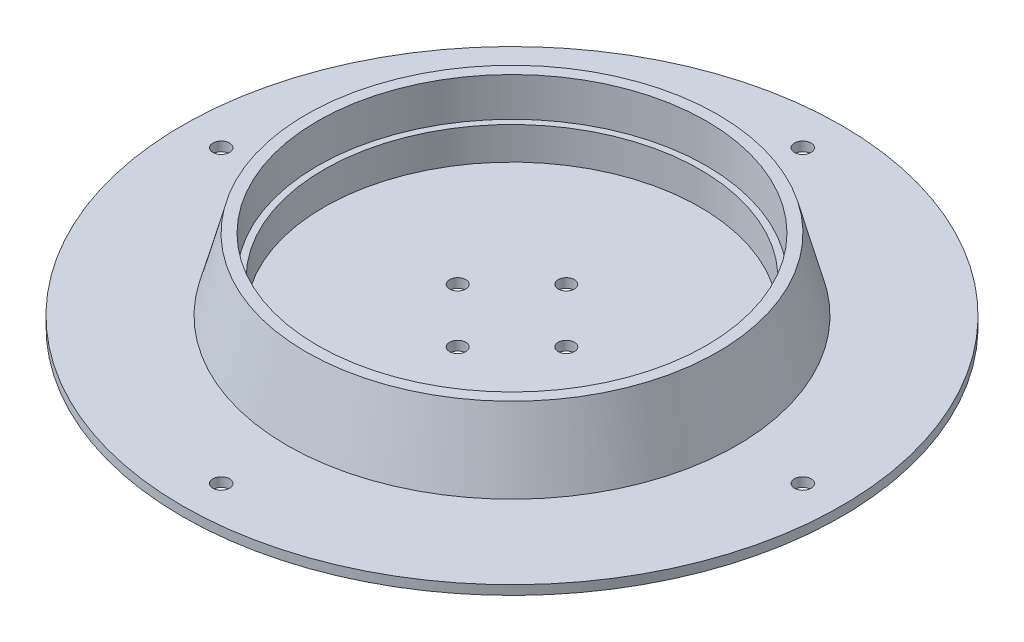
ISO-10303-21;
HEADER;
FILE_DESCRIPTION(('STEP AP214'),'2;1');
FILE_NAME('part.step','',(''),(''),'','','');
FILE_SCHEMA(('AUTOMOTIVE_DESIGN { 1 0 10303 214 1 1 1 1 }'));
ENDSEC;
DATA;
#1=APPLICATION_CONTEXT('core data for automotive mechanical design processes');
#2=APPLICATION_PROTOCOL_DEFINITION('international standard','automotive_design',2000,#1);
#3=PRODUCT_CONTEXT('',#1,'mechanical');
#4=PRODUCT('Part','Part','',(#3));
#5=PRODUCT_RELATED_PRODUCT_CATEGORY('part','',(#4));
#6=PRODUCT_DEFINITION_FORMATION('','',#4);
#7=PRODUCT_DEFINITION_CONTEXT('part definition',#1,'design');
#8=PRODUCT_DEFINITION('design','',#6,#7);
#9=PRODUCT_DEFINITION_SHAPE('','',#8);
#10=(LENGTH_UNIT() NAMED_UNIT(*) SI_UNIT(.MILLI.,.METRE.));
#11=(NAMED_UNIT(*) PLANE_ANGLE_UNIT() SI_UNIT($,.RADIAN.));
#12=(NAMED_UNIT(*) SI_UNIT($,.STERADIAN.) SOLID_ANGLE_UNIT());
#13=UNCERTAINTY_MEASURE_WITH_UNIT(LENGTH_MEASURE(1.E-05),#10,'distance_accuracy_value','');
#14=(GEOMETRIC_REPRESENTATION_CONTEXT(3) GLOBAL_UNCERTAINTY_ASSIGNED_CONTEXT((#13)) GLOBAL_UNIT_ASSIGNED_CONTEXT((#10,
#11,#12)) REPRESENTATION_CONTEXT('',''));
#15=CARTESIAN_POINT('',(0.,0.,0.));
#16=DIRECTION('',(0.,0.,1.));
#17=DIRECTION('',(1.,0.,0.));
#18=AXIS2_PLACEMENT_3D('',#15,#16,#17);
#19=CARTESIAN_POINT('',(0.,2.4,0.));
#20=DIRECTION('',(0.,1.,0.));
#21=DIRECTION('',(0.,0.,1.));
#22=AXIS2_PLACEMENT_3D('',#19,#20,#21);
#23=PLANE('',#22);
#24=CARTESIAN_POINT('',(0.,2.4,0.));
#25=DIRECTION('',(0.,1.,0.));
#26=DIRECTION('',(0.,0.,1.));
#27=AXIS2_PLACEMENT_3D('',#24,#25,#26);
#28=CIRCLE('',#27,58.);
#29=CARTESIAN_POINT('',(0.,2.4,58.));
#30=VERTEX_POINT('',#29);
#31=EDGE_CURVE('E10',#30,#30,#28,.T.);
#32=ORIENTED_EDGE('',*,*,#31,.F.);
#33=EDGE_LOOP('',(#32));
#34=FACE_BOUND('',#33,.T.);
#35=CARTESIAN_POINT('',(75.,2.4,5.2372220082647E-13));
#36=DIRECTION('',(0.,1.,0.));
#37=DIRECTION('',(0.,0.,1.));
#38=AXIS2_PLACEMENT_3D('',#35,#36,#37);
#39=CIRCLE('',#38,2.13245703125);
#40=CARTESIAN_POINT('',(75.,2.4,2.13245703125052));
#41=VERTEX_POINT('',#40);
#42=EDGE_CURVE('E92',#41,#41,#39,.T.);
#43=ORIENTED_EDGE('',*,*,#42,.F.);
#44=EDGE_LOOP('',(#43));
#45=FACE_BOUND('',#44,.T.);
#46=CARTESIAN_POINT('',(-75.,2.4,0.));
#47=DIRECTION('',(0.,1.,0.));
#48=DIRECTION('',(0.,0.,1.));
#49=AXIS2_PLACEMENT_3D('',#46,#47,#48);
#50=CIRCLE('',#49,2.13245703125);
#51=CARTESIAN_POINT('',(-75.,2.4,2.13245703125));
#52=VERTEX_POINT('',#51);
#53=EDGE_CURVE('E104',#52,#52,#50,.T.);
#54=ORIENTED_EDGE('',*,*,#53,.F.);
#55=EDGE_LOOP('',(#54));
#56=FACE_BOUND('',#55,.T.);
#57=CARTESIAN_POINT('',(0.,2.4,0.));
#58=DIRECTION('',(0.,1.,0.));
#59=DIRECTION('',(0.,0.,1.));
#60=AXIS2_PLACEMENT_3D('',#57,#58,#59);
#61=CIRCLE('',#60,85.);
#62=CARTESIAN_POINT('',(0.,2.4,85.));
#63=VERTEX_POINT('',#62);
#64=EDGE_CURVE('E47',#63,#63,#61,.T.);
#65=ORIENTED_EDGE('',*,*,#64,.T.);
#66=EDGE_LOOP('',(#65));
#67=FACE_BOUND('',#66,.T.);
#68=CARTESIAN_POINT('',(2.61861100413235E-13,2.4,-75.));
#69=DIRECTION('',(0.,1.,0.));
#70=DIRECTION('',(0.,0.,1.));
#71=AXIS2_PLACEMENT_3D('',#68,#69,#70);
#72=CIRCLE('',#71,2.13245703125);
#73=CARTESIAN_POINT('',(2.61861100413235E-13,2.4,-72.86754296875));
#74=VERTEX_POINT('',#73);
#75=EDGE_CURVE('E98',#74,#74,#72,.T.);
#76=ORIENTED_EDGE('',*,*,#75,.F.);
#77=EDGE_LOOP('',(#76));
#78=FACE_BOUND('',#77,.T.);
#79=CARTESIAN_POINT('',(-7.85583301239705E-13,2.4,75.));
#80=DIRECTION('',(0.,1.,0.));
#81=DIRECTION('',(0.,0.,1.));
#82=AXIS2_PLACEMENT_3D('',#79,#80,#81);
#83=CIRCLE('',#82,2.13245703125);
#84=CARTESIAN_POINT('',(-7.85583301239705E-13,2.4,77.13245703125));
#85=VERTEX_POINT('',#84);
#86=EDGE_CURVE('E86',#85,#85,#83,.T.);
#87=ORIENTED_EDGE('',*,*,#86,.F.);
#88=EDGE_LOOP('',(#87));
#89=FACE_BOUND('',#88,.T.);
#90=ADVANCED_FACE('F39',(#34,#45,#56,#67,#78,#89),#23,.T.);
#91=CARTESIAN_POINT('',(0.,0.,0.));
#92=DIRECTION('',(0.,1.,0.));
#93=DIRECTION('',(0.,0.,1.));
#94=AXIS2_PLACEMENT_3D('',#91,#92,#93);
#95=PLANE('',#94);
#96=CARTESIAN_POINT('',(0.,0.,0.));
#97=DIRECTION('',(0.,1.,0.));
#98=DIRECTION('',(0.,0.,1.));
#99=AXIS2_PLACEMENT_3D('',#96,#97,#98);
#100=CIRCLE('',#99,85.);
#101=CARTESIAN_POINT('',(0.,0.,85.));
#102=VERTEX_POINT('',#101);
#103=EDGE_CURVE('E43',#102,#102,#100,.T.);
#104=ORIENTED_EDGE('',*,*,#103,.F.);
#105=EDGE_LOOP('',(#104));
#106=FACE_BOUND('',#105,.T.);
#107=CARTESIAN_POINT('',(-75.,0.,0.));
#108=DIRECTION('',(0.,1.,0.));
#109=DIRECTION('',(0.,0.,1.));
#110=AXIS2_PLACEMENT_3D('',#107,#108,#109);
#111=CIRCLE('',#110,2.13245703125);
#112=CARTESIAN_POINT('',(-75.,0.,2.13245703125));
#113=VERTEX_POINT('',#112);
#114=EDGE_CURVE('E101',#113,#113,#111,.T.);
#115=ORIENTED_EDGE('',*,*,#114,.T.);
#116=EDGE_LOOP('',(#115));
#117=FACE_BOUND('',#116,.T.);
#118=CARTESIAN_POINT('',(2.61861100413235E-13,0.,-75.));
#119=DIRECTION('',(0.,1.,0.));
#120=DIRECTION('',(0.,0.,1.));
#121=AXIS2_PLACEMENT_3D('',#118,#119,#120);
#122=CIRCLE('',#121,2.13245703125);
#123=CARTESIAN_POINT('',(2.61861100413235E-13,0.,-72.86754296875));
#124=VERTEX_POINT('',#123);
#125=EDGE_CURVE('E95',#124,#124,#122,.T.);
#126=ORIENTED_EDGE('',*,*,#125,.T.);
#127=EDGE_LOOP('',(#126));
#128=FACE_BOUND('',#127,.T.);
#129=CARTESIAN_POINT('',(75.,0.,5.2372220082647E-13));
#130=DIRECTION('',(0.,1.,0.));
#131=DIRECTION('',(0.,0.,1.));
#132=AXIS2_PLACEMENT_3D('',#129,#130,#131);
#133=CIRCLE('',#132,2.13245703125);
#134=CARTESIAN_POINT('',(75.,0.,2.13245703125052));
#135=VERTEX_POINT('',#134);
#136=EDGE_CURVE('E89',#135,#135,#133,.T.);
#137=ORIENTED_EDGE('',*,*,#136,.T.);
#138=EDGE_LOOP('',(#137));
#139=FACE_BOUND('',#138,.T.);
#140=CARTESIAN_POINT('',(-7.85583301239705E-13,0.,75.));
#141=DIRECTION('',(0.,1.,0.));
#142=DIRECTION('',(0.,0.,1.));
#143=AXIS2_PLACEMENT_3D('',#140,#141,#142);
#144=CIRCLE('',#143,2.13245703125);
#145=CARTESIAN_POINT('',(-7.85583301239705E-13,0.,77.13245703125));
#146=VERTEX_POINT('',#145);
#147=EDGE_CURVE('E85',#146,#146,#144,.T.);
#148=ORIENTED_EDGE('',*,*,#147,.T.);
#149=EDGE_LOOP('',(#148));
#150=FACE_BOUND('',#149,.T.);
#151=CARTESIAN_POINT('',(-14.,0.,0.));
#152=DIRECTION('',(0.,1.,0.));
#153=DIRECTION('',(0.,0.,1.));
#154=AXIS2_PLACEMENT_3D('',#151,#152,#153);
#155=CIRCLE('',#154,2.1);
#156=CARTESIAN_POINT('',(-14.,0.,2.1));
#157=VERTEX_POINT('',#156);
#158=EDGE_CURVE('E80',#157,#157,#155,.T.);
#159=ORIENTED_EDGE('',*,*,#158,.T.);
#160=EDGE_LOOP('',(#159));
#161=FACE_BOUND('',#160,.T.);
#162=CARTESIAN_POINT('',(0.,0.,-14.));
#163=DIRECTION('',(0.,1.,0.));
#164=DIRECTION('',(0.,0.,1.));
#165=AXIS2_PLACEMENT_3D('',#162,#163,#164);
#166=CIRCLE('',#165,2.1);
#167=CARTESIAN_POINT('',(0.,0.,-11.9));
#168=VERTEX_POINT('',#167);
#169=EDGE_CURVE('E75',#168,#168,#166,.T.);
#170=ORIENTED_EDGE('',*,*,#169,.T.);
#171=EDGE_LOOP('',(#170));
#172=FACE_BOUND('',#171,.T.);
#173=CARTESIAN_POINT('',(14.,0.,0.));
#174=DIRECTION('',(0.,1.,0.));
#175=DIRECTION('',(0.,0.,1.));
#176=AXIS2_PLACEMENT_3D('',#173,#174,#175);
#177=CIRCLE('',#176,2.1);
#178=CARTESIAN_POINT('',(14.,0.,2.1000000000001));
#179=VERTEX_POINT('',#178);
#180=EDGE_CURVE('E67',#179,#179,#177,.T.);
#181=ORIENTED_EDGE('',*,*,#180,.T.);
#182=EDGE_LOOP('',(#181));
#183=FACE_BOUND('',#182,.T.);
#184=CARTESIAN_POINT('',(-1.46642216231412E-13,0.,14.));
#185=DIRECTION('',(0.,1.,0.));
#186=DIRECTION('',(0.,0.,1.));
#187=AXIS2_PLACEMENT_3D('',#184,#185,#186);
#188=CIRCLE('',#187,2.1);
#189=CARTESIAN_POINT('',(-1.46642216231412E-13,0.,16.1));
#190=VERTEX_POINT('',#189);
#191=EDGE_CURVE('E59',#190,#190,#188,.T.);
#192=ORIENTED_EDGE('',*,*,#191,.T.);
#193=EDGE_LOOP('',(#192));
#194=FACE_BOUND('',#193,.T.);
#195=ADVANCED_FACE('F110',(#106,#117,#128,#139,#150,#161,#172,#183,#194),#95,.F.);
#196=CARTESIAN_POINT('',(0.,2.4,0.));
#197=DIRECTION('',(0.,-1.,0.));
#198=DIRECTION('',(0.,0.,-1.));
#199=AXIS2_PLACEMENT_3D('',#196,#197,#198);
#200=CYLINDRICAL_SURFACE('',#199,85.);
#201=ORIENTED_EDGE('',*,*,#64,.F.);
#202=EDGE_LOOP('',(#201));
#203=FACE_BOUND('',#202,.T.);
#204=ORIENTED_EDGE('',*,*,#103,.T.);
#205=EDGE_LOOP('',(#204));
#206=FACE_BOUND('',#205,.T.);
#207=ADVANCED_FACE('F41',(#203,#206),#200,.T.);
#208=CARTESIAN_POINT('',(-75.,2.4,0.));
#209=DIRECTION('',(0.,-1.,0.));
#210=DIRECTION('',(0.,0.,-1.));
#211=AXIS2_PLACEMENT_3D('',#208,#209,#210);
#212=CYLINDRICAL_SURFACE('',#211,2.13245703125);
#213=ORIENTED_EDGE('',*,*,#53,.T.);
#214=EDGE_LOOP('',(#213));
#215=FACE_BOUND('',#214,.T.);
#216=ORIENTED_EDGE('',*,*,#114,.F.);
#217=EDGE_LOOP('',(#216));
#218=FACE_BOUND('',#217,.T.);
#219=ADVANCED_FACE('F113',(#215,#218),#212,.F.);
#220=CARTESIAN_POINT('',(2.61861100413235E-13,2.4,-75.));
#221=DIRECTION('',(0.,-1.,0.));
#222=DIRECTION('',(0.,0.,-1.));
#223=AXIS2_PLACEMENT_3D('',#220,#221,#222);
#224=CYLINDRICAL_SURFACE('',#223,2.13245703125);
#225=ORIENTED_EDGE('',*,*,#75,.T.);
#226=EDGE_LOOP('',(#225));
#227=FACE_BOUND('',#226,.T.);
#228=ORIENTED_EDGE('',*,*,#125,.F.);
#229=EDGE_LOOP('',(#228));
#230=FACE_BOUND('',#229,.T.);
#231=ADVANCED_FACE('F115',(#227,#230),#224,.F.);
#232=CARTESIAN_POINT('',(75.,2.4,5.2372220082647E-13));
#233=DIRECTION('',(0.,-1.,0.));
#234=DIRECTION('',(0.,0.,-1.));
#235=AXIS2_PLACEMENT_3D('',#232,#233,#234);
#236=CYLINDRICAL_SURFACE('',#235,2.13245703125);
#237=ORIENTED_EDGE('',*,*,#42,.T.);
#238=EDGE_LOOP('',(#237));
#239=FACE_BOUND('',#238,.T.);
#240=ORIENTED_EDGE('',*,*,#136,.F.);
#241=EDGE_LOOP('',(#240));
#242=FACE_BOUND('',#241,.T.);
#243=ADVANCED_FACE('F122',(#239,#242),#236,.F.);
#244=CARTESIAN_POINT('',(-7.85583301239705E-13,2.4,75.));
#245=DIRECTION('',(0.,-1.,0.));
#246=DIRECTION('',(0.,0.,-1.));
#247=AXIS2_PLACEMENT_3D('',#244,#245,#246);
#248=CYLINDRICAL_SURFACE('',#247,2.13245703125);
#249=ORIENTED_EDGE('',*,*,#86,.T.);
#250=EDGE_LOOP('',(#249));
#251=FACE_BOUND('',#250,.T.);
#252=ORIENTED_EDGE('',*,*,#147,.F.);
#253=EDGE_LOOP('',(#252));
#254=FACE_BOUND('',#253,.T.);
#255=ADVANCED_FACE('F146',(#251,#254),#248,.F.);
#256=CARTESIAN_POINT('',(-14.,2.4,0.));
#257=DIRECTION('',(0.,-1.,0.));
#258=DIRECTION('',(0.,0.,-1.));
#259=AXIS2_PLACEMENT_3D('',#256,#257,#258);
#260=CYLINDRICAL_SURFACE('',#259,2.1);
#261=CARTESIAN_POINT('',(-14.,2.4,0.));
#262=DIRECTION('',(0.,1.,0.));
#263=DIRECTION('',(0.,0.,1.));
#264=AXIS2_PLACEMENT_3D('',#261,#262,#263);
#265=CIRCLE('',#264,2.1);
#266=CARTESIAN_POINT('',(-14.,2.4,2.1));
#267=VERTEX_POINT('',#266);
#268=EDGE_CURVE('E71',#267,#267,#265,.T.);
#269=ORIENTED_EDGE('',*,*,#268,.T.);
#270=EDGE_LOOP('',(#269));
#271=FACE_BOUND('',#270,.T.);
#272=ORIENTED_EDGE('',*,*,#158,.F.);
#273=EDGE_LOOP('',(#272));
#274=FACE_BOUND('',#273,.T.);
#275=ADVANCED_FACE('F149',(#271,#274),#260,.F.);
#276=CARTESIAN_POINT('',(0.,2.4,-14.));
#277=DIRECTION('',(0.,-1.,0.));
#278=DIRECTION('',(0.,0.,-1.));
#279=AXIS2_PLACEMENT_3D('',#276,#277,#278);
#280=CYLINDRICAL_SURFACE('',#279,2.1);
#281=CARTESIAN_POINT('',(0.,2.4,-14.));
#282=DIRECTION('',(0.,1.,0.));
#283=DIRECTION('',(0.,0.,1.));
#284=AXIS2_PLACEMENT_3D('',#281,#282,#283);
#285=CIRCLE('',#284,2.1);
#286=CARTESIAN_POINT('',(0.,2.4,-11.9));
#287=VERTEX_POINT('',#286);
#288=EDGE_CURVE('E64',#287,#287,#285,.T.);
#289=ORIENTED_EDGE('',*,*,#288,.T.);
#290=EDGE_LOOP('',(#289));
#291=FACE_BOUND('',#290,.T.);
#292=ORIENTED_EDGE('',*,*,#169,.F.);
#293=EDGE_LOOP('',(#292));
#294=FACE_BOUND('',#293,.T.);
#295=ADVANCED_FACE('F174',(#291,#294),#280,.F.);
#296=CARTESIAN_POINT('',(14.,2.4,0.));
#297=DIRECTION('',(0.,-1.,0.));
#298=DIRECTION('',(0.,0.,-1.));
#299=AXIS2_PLACEMENT_3D('',#296,#297,#298);
#300=CYLINDRICAL_SURFACE('',#299,2.1);
#301=CARTESIAN_POINT('',(14.,2.4,0.));
#302=DIRECTION('',(0.,1.,0.));
#303=DIRECTION('',(0.,0.,1.));
#304=AXIS2_PLACEMENT_3D('',#301,#302,#303);
#305=CIRCLE('',#304,2.1);
#306=CARTESIAN_POINT('',(14.,2.4,2.1000000000001));
#307=VERTEX_POINT('',#306);
#308=EDGE_CURVE('E68',#307,#307,#305,.T.);
#309=ORIENTED_EDGE('',*,*,#308,.T.);
#310=EDGE_LOOP('',(#309));
#311=FACE_BOUND('',#310,.T.);
#312=ORIENTED_EDGE('',*,*,#180,.F.);
#313=EDGE_LOOP('',(#312));
#314=FACE_BOUND('',#313,.T.);
#315=ADVANCED_FACE('F164',(#311,#314),#300,.F.);
#316=CARTESIAN_POINT('',(-1.46642216231412E-13,2.4,14.));
#317=DIRECTION('',(0.,-1.,0.));
#318=DIRECTION('',(0.,0.,-1.));
#319=AXIS2_PLACEMENT_3D('',#316,#317,#318);
#320=CYLINDRICAL_SURFACE('',#319,2.1);
#321=CARTESIAN_POINT('',(-1.46642216231412E-13,2.4,14.));
#322=DIRECTION('',(0.,1.,0.));
#323=DIRECTION('',(0.,0.,1.));
#324=AXIS2_PLACEMENT_3D('',#321,#322,#323);
#325=CIRCLE('',#324,2.1);
#326=CARTESIAN_POINT('',(-1.46642216231412E-13,2.4,16.1));
#327=VERTEX_POINT('',#326);
#328=EDGE_CURVE('E61',#327,#327,#325,.T.);
#329=ORIENTED_EDGE('',*,*,#328,.T.);
#330=EDGE_LOOP('',(#329));
#331=FACE_BOUND('',#330,.T.);
#332=ORIENTED_EDGE('',*,*,#191,.F.);
#333=EDGE_LOOP('',(#332));
#334=FACE_BOUND('',#333,.T.);
#335=ADVANCED_FACE('F162',(#331,#334),#320,.F.);
#336=CARTESIAN_POINT('',(0.,20.8,0.));
#337=DIRECTION('',(0.,1.,0.));
#338=DIRECTION('',(0.,0.,1.));
#339=AXIS2_PLACEMENT_3D('',#336,#337,#338);
#340=PLANE('',#339);
#341=CARTESIAN_POINT('',(0.,20.8,0.));
#342=DIRECTION('',(0.,1.,0.));
#343=DIRECTION('',(0.,0.,1.));
#344=AXIS2_PLACEMENT_3D('',#341,#342,#343);
#345=CIRCLE('',#344,50.15);
#346=CARTESIAN_POINT('',(0.,20.8,50.15));
#347=VERTEX_POINT('',#346);
#348=EDGE_CURVE('E54',#347,#347,#345,.T.);
#349=ORIENTED_EDGE('',*,*,#348,.F.);
#350=EDGE_LOOP('',(#349));
#351=FACE_BOUND('',#350,.T.);
#352=CARTESIAN_POINT('',(0.,20.8,0.));
#353=DIRECTION('',(0.,1.,0.));
#354=DIRECTION('',(0.,0.,1.));
#355=AXIS2_PLACEMENT_3D('',#352,#353,#354);
#356=CIRCLE('',#355,53.0697348592673);
#357=CARTESIAN_POINT('',(0.,20.8,53.0697348592673));
#358=VERTEX_POINT('',#357);
#359=EDGE_CURVE('E56',#358,#358,#356,.T.);
#360=ORIENTED_EDGE('',*,*,#359,.T.);
#361=EDGE_LOOP('',(#360));
#362=FACE_BOUND('',#361,.T.);
#363=ADVANCED_FACE('F163',(#351,#362),#340,.T.);
#364=CARTESIAN_POINT('',(0.,2.4,0.));
#365=DIRECTION('',(0.,-1.,0.));
#366=DIRECTION('',(0.,0.,1.));
#367=AXIS2_PLACEMENT_3D('',#364,#365,#366);
#368=CONICAL_SURFACE('',#367,58.,0.261799387799149);
#369=ORIENTED_EDGE('',*,*,#359,.F.);
#370=EDGE_LOOP('',(#369));
#371=FACE_BOUND('',#370,.T.);
#372=ORIENTED_EDGE('',*,*,#31,.T.);
#373=EDGE_LOOP('',(#372));
#374=FACE_BOUND('',#373,.T.);
#375=ADVANCED_FACE('F171',(#371,#374),#368,.T.);
#376=CARTESIAN_POINT('',(0.,10.8,0.));
#377=DIRECTION('',(0.,1.,0.));
#378=DIRECTION('',(0.,0.,1.));
#379=AXIS2_PLACEMENT_3D('',#376,#377,#378);
#380=CYLINDRICAL_SURFACE('',#379,50.15);
#381=CARTESIAN_POINT('',(0.,10.8,0.));
#382=DIRECTION('',(0.,1.,0.));
#383=DIRECTION('',(0.,0.,1.));
#384=AXIS2_PLACEMENT_3D('',#381,#382,#383);
#385=CIRCLE('',#384,50.15);
#386=CARTESIAN_POINT('',(0.,10.8,50.15));
#387=VERTEX_POINT('',#386);
#388=EDGE_CURVE('E60',#387,#387,#385,.T.);
#389=ORIENTED_EDGE('',*,*,#388,.F.);
#390=EDGE_LOOP('',(#389));
#391=FACE_BOUND('',#390,.T.);
#392=ORIENTED_EDGE('',*,*,#348,.T.);
#393=EDGE_LOOP('',(#392));
#394=FACE_BOUND('',#393,.T.);
#395=ADVANCED_FACE('F234',(#391,#394),#380,.F.);
#396=CARTESIAN_POINT('',(0.,10.8,0.));
#397=DIRECTION('',(0.,1.,0.));
#398=DIRECTION('',(0.,0.,1.));
#399=AXIS2_PLACEMENT_3D('',#396,#397,#398);
#400=PLANE('',#399);
#401=CARTESIAN_POINT('',(0.,10.8,0.));
#402=DIRECTION('',(0.,1.,0.));
#403=DIRECTION('',(0.,0.,1.));
#404=AXIS2_PLACEMENT_3D('',#401,#402,#403);
#405=CIRCLE('',#404,48.5);
#406=CARTESIAN_POINT('',(0.,10.8,48.5));
#407=VERTEX_POINT('',#406);
#408=EDGE_CURVE('E285',#407,#407,#405,.T.);
#409=ORIENTED_EDGE('',*,*,#408,.F.);
#410=EDGE_LOOP('',(#409));
#411=FACE_BOUND('',#410,.T.);
#412=ORIENTED_EDGE('',*,*,#388,.T.);
#413=EDGE_LOOP('',(#412));
#414=FACE_BOUND('',#413,.T.);
#415=ADVANCED_FACE('F242',(#411,#414),#400,.T.);
#416=CARTESIAN_POINT('',(0.,2.4,0.));
#417=DIRECTION('',(0.,1.,0.));
#418=DIRECTION('',(0.,0.,1.));
#419=AXIS2_PLACEMENT_3D('',#416,#417,#418);
#420=CYLINDRICAL_SURFACE('',#419,48.5);
#421=CARTESIAN_POINT('',(0.,2.4,0.));
#422=DIRECTION('',(0.,1.,0.));
#423=DIRECTION('',(0.,0.,1.));
#424=AXIS2_PLACEMENT_3D('',#421,#422,#423);
#425=CIRCLE('',#424,48.5);
#426=CARTESIAN_POINT('',(0.,2.4,48.5));
#427=VERTEX_POINT('',#426);
#428=EDGE_CURVE('E72',#427,#427,#425,.T.);
#429=ORIENTED_EDGE('',*,*,#428,.F.);
#430=EDGE_LOOP('',(#429));
#431=FACE_BOUND('',#430,.T.);
#432=ORIENTED_EDGE('',*,*,#408,.T.);
#433=EDGE_LOOP('',(#432));
#434=FACE_BOUND('',#433,.T.);
#435=ADVANCED_FACE('F252',(#431,#434),#420,.F.);
#436=CARTESIAN_POINT('',(0.,2.4,0.));
#437=DIRECTION('',(0.,1.,0.));
#438=DIRECTION('',(0.,0.,1.));
#439=AXIS2_PLACEMENT_3D('',#436,#437,#438);
#440=PLANE('',#439);
#441=ORIENTED_EDGE('',*,*,#328,.F.);
#442=EDGE_LOOP('',(#441));
#443=FACE_BOUND('',#442,.T.);
#444=ORIENTED_EDGE('',*,*,#288,.F.);
#445=EDGE_LOOP('',(#444));
#446=FACE_BOUND('',#445,.T.);
#447=ORIENTED_EDGE('',*,*,#268,.F.);
#448=EDGE_LOOP('',(#447));
#449=FACE_BOUND('',#448,.T.);
#450=ORIENTED_EDGE('',*,*,#308,.F.);
#451=EDGE_LOOP('',(#450));
#452=FACE_BOUND('',#451,.T.);
#453=ORIENTED_EDGE('',*,*,#428,.T.);
#454=EDGE_LOOP('',(#453));
#455=FACE_BOUND('',#454,.T.);
#456=ADVANCED_FACE('F262',(#443,#446,#449,#452,#455),#440,.T.);
#457=CLOSED_SHELL('',(#90,#195,#207,#219,#231,#243,#255,#275,#295,#315,#335,#363,#375,#395,#415,
#435,#456));
#458=MANIFOLD_SOLID_BREP('B2',#457);
#459=ADVANCED_BREP_SHAPE_REPRESENTATION('',(#18,#458),#14);
#460=SHAPE_DEFINITION_REPRESENTATION(#9,#459);
ENDSEC;
END-ISO-10303-21;
